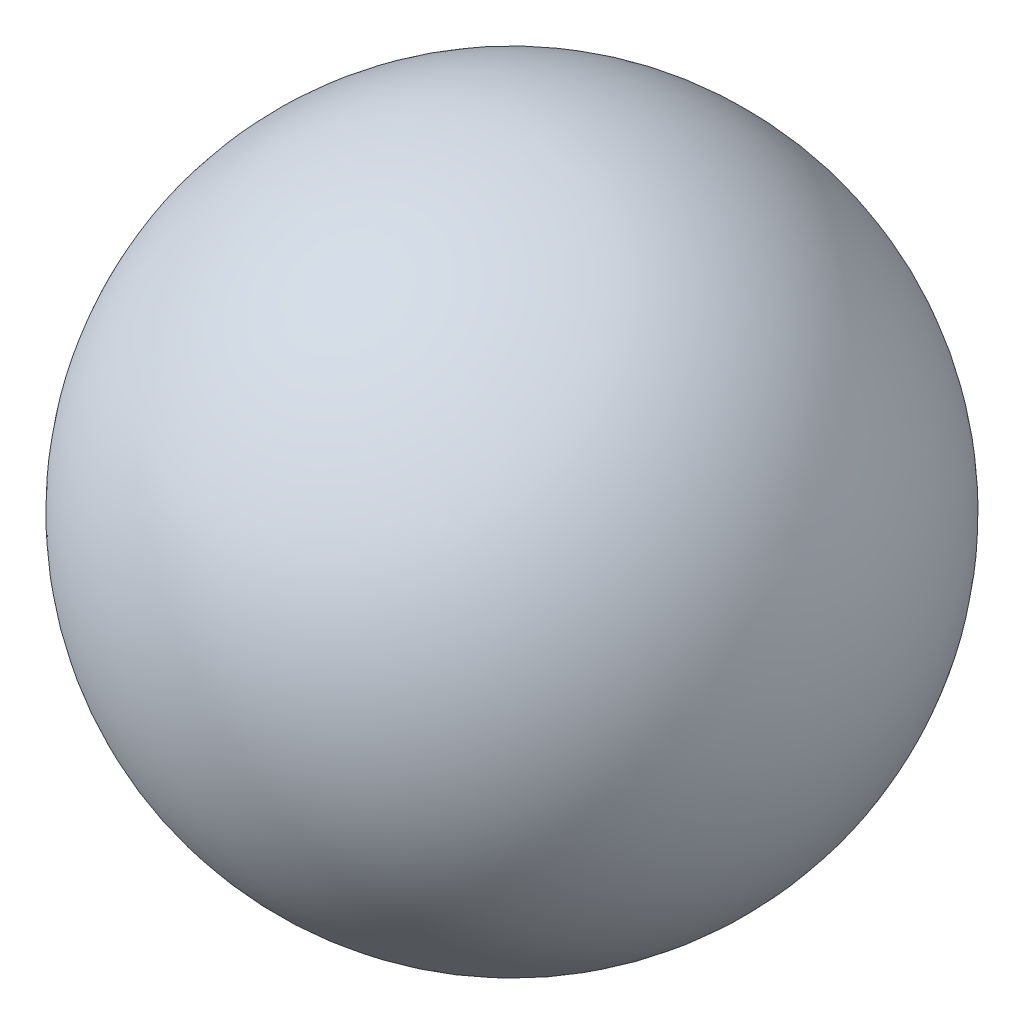
ISO-10303-21;
HEADER;
FILE_DESCRIPTION(('STEP AP214'),'2;1');
FILE_NAME('part.step','',(''),(''),'','','');
FILE_SCHEMA(('AUTOMOTIVE_DESIGN { 1 0 10303 214 1 1 1 1 }'));
ENDSEC;
DATA;
#1=APPLICATION_CONTEXT('core data for automotive mechanical design processes');
#2=APPLICATION_PROTOCOL_DEFINITION('international standard','automotive_design',2000,#1);
#3=PRODUCT_CONTEXT('',#1,'mechanical');
#4=PRODUCT('Part','Part','',(#3));
#5=PRODUCT_RELATED_PRODUCT_CATEGORY('part','',(#4));
#6=PRODUCT_DEFINITION_FORMATION('','',#4);
#7=PRODUCT_DEFINITION_CONTEXT('part definition',#1,'design');
#8=PRODUCT_DEFINITION('design','',#6,#7);
#9=PRODUCT_DEFINITION_SHAPE('','',#8);
#10=(LENGTH_UNIT() NAMED_UNIT(*) SI_UNIT(.MILLI.,.METRE.));
#11=(NAMED_UNIT(*) PLANE_ANGLE_UNIT() SI_UNIT($,.RADIAN.));
#12=(NAMED_UNIT(*) SI_UNIT($,.STERADIAN.) SOLID_ANGLE_UNIT());
#13=UNCERTAINTY_MEASURE_WITH_UNIT(LENGTH_MEASURE(1.E-05),#10,'distance_accuracy_value','');
#14=(GEOMETRIC_REPRESENTATION_CONTEXT(3) GLOBAL_UNCERTAINTY_ASSIGNED_CONTEXT((#13)) GLOBAL_UNIT_ASSIGNED_CONTEXT((#10,
#11,#12)) REPRESENTATION_CONTEXT('',''));
#15=CARTESIAN_POINT('',(0.,0.,0.));
#16=DIRECTION('',(0.,0.,1.));
#17=DIRECTION('',(1.,0.,0.));
#18=AXIS2_PLACEMENT_3D('',#15,#16,#17);
#19=CARTESIAN_POINT('',(2.5,4.75,0.));
#20=DIRECTION('',(-1.,0.,0.));
#21=DIRECTION('',(0.,1.,0.));
#22=AXIS2_PLACEMENT_3D('',#19,#20,#21);
#23=SPHERICAL_SURFACE('',#22,1.1905);
#24=CARTESIAN_POINT('',(1.3095,4.75,0.));
#25=VERTEX_POINT('',#24);
#26=VERTEX_LOOP('',#25);
#27=FACE_BOUND('',#26,.T.);
#28=ADVANCED_FACE('F29',(#27),#23,.T.);
#29=CLOSED_SHELL('',(#28));
#30=MANIFOLD_SOLID_BREP('B2',#29);
#31=ADVANCED_BREP_SHAPE_REPRESENTATION('',(#18,#30),#14);
#32=SHAPE_DEFINITION_REPRESENTATION(#9,#31);
ENDSEC;
END-ISO-10303-21;
